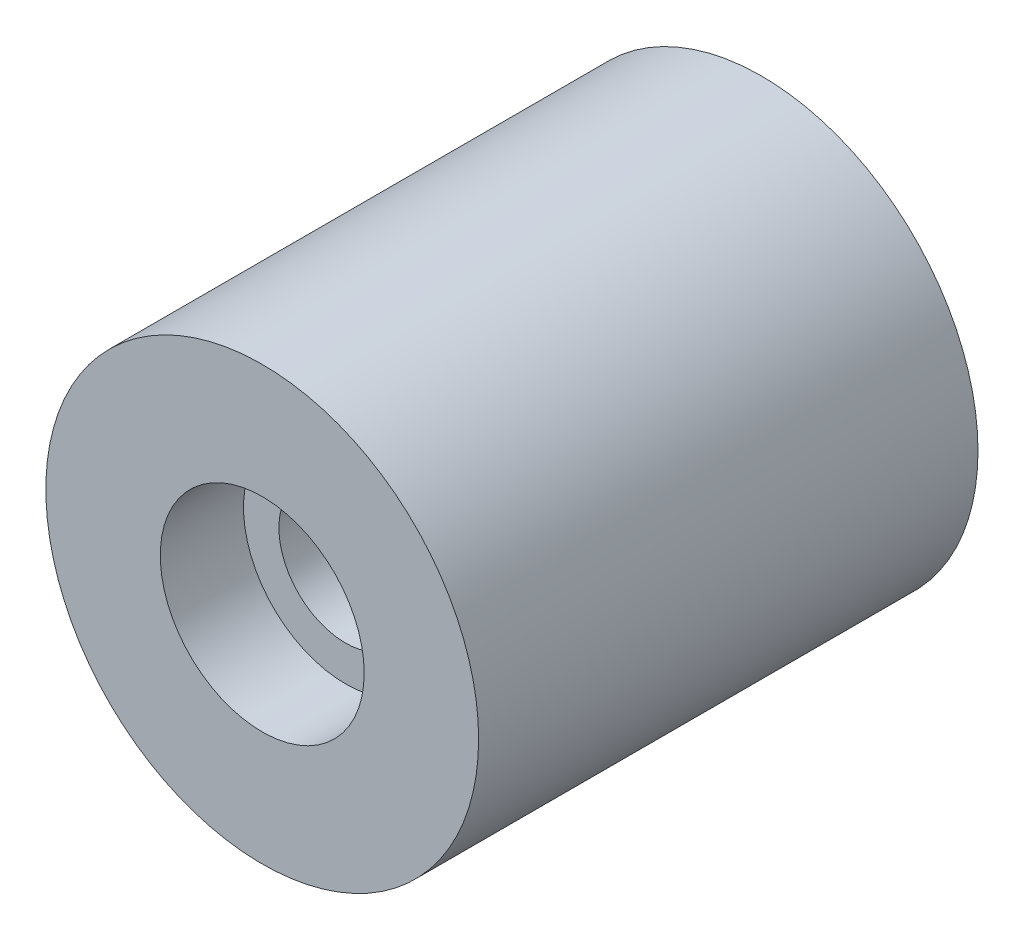
ISO-10303-21;
HEADER;
FILE_DESCRIPTION(('STEP AP214'),'2;1');
FILE_NAME('part.step','',(''),(''),'','','');
FILE_SCHEMA(('AUTOMOTIVE_DESIGN { 1 0 10303 214 1 1 1 1 }'));
ENDSEC;
DATA;
#1=APPLICATION_CONTEXT('core data for automotive mechanical design processes');
#2=APPLICATION_PROTOCOL_DEFINITION('international standard','automotive_design',2000,#1);
#3=PRODUCT_CONTEXT('',#1,'mechanical');
#4=PRODUCT('Part','Part','',(#3));
#5=PRODUCT_RELATED_PRODUCT_CATEGORY('part','',(#4));
#6=PRODUCT_DEFINITION_FORMATION('','',#4);
#7=PRODUCT_DEFINITION_CONTEXT('part definition',#1,'design');
#8=PRODUCT_DEFINITION('design','',#6,#7);
#9=PRODUCT_DEFINITION_SHAPE('','',#8);
#10=(LENGTH_UNIT() NAMED_UNIT(*) SI_UNIT(.MILLI.,.METRE.));
#11=(NAMED_UNIT(*) PLANE_ANGLE_UNIT() SI_UNIT($,.RADIAN.));
#12=(NAMED_UNIT(*) SI_UNIT($,.STERADIAN.) SOLID_ANGLE_UNIT());
#13=UNCERTAINTY_MEASURE_WITH_UNIT(LENGTH_MEASURE(1.E-05),#10,'distance_accuracy_value','');
#14=(GEOMETRIC_REPRESENTATION_CONTEXT(3) GLOBAL_UNCERTAINTY_ASSIGNED_CONTEXT((#13)) GLOBAL_UNIT_ASSIGNED_CONTEXT((#10,
#11,#12)) REPRESENTATION_CONTEXT('',''));
#15=CARTESIAN_POINT('',(0.,0.,0.));
#16=DIRECTION('',(0.,0.,1.));
#17=DIRECTION('',(1.,0.,0.));
#18=AXIS2_PLACEMENT_3D('',#15,#16,#17);
#19=CARTESIAN_POINT('',(15.,0.,6.));
#20=DIRECTION('',(0.,0.,1.));
#21=DIRECTION('',(1.,0.,0.));
#22=AXIS2_PLACEMENT_3D('',#19,#20,#21);
#23=CYLINDRICAL_SURFACE('',#22,2.);
#24=CARTESIAN_POINT('',(15.,0.,18.5));
#25=DIRECTION('',(0.,0.,1.));
#26=DIRECTION('',(1.,0.,0.));
#27=AXIS2_PLACEMENT_3D('',#24,#25,#26);
#28=CIRCLE('',#27,2.);
#29=CARTESIAN_POINT('',(17.,0.,18.5));
#30=VERTEX_POINT('',#29);
#31=EDGE_CURVE('E50',#30,#30,#28,.F.);
#32=ORIENTED_EDGE('',*,*,#31,.F.);
#33=EDGE_LOOP('',(#32));
#34=FACE_BOUND('',#33,.T.);
#35=CARTESIAN_POINT('',(15.,0.,8.5));
#36=DIRECTION('',(0.,0.,-1.));
#37=DIRECTION('',(-1.,0.,0.));
#38=AXIS2_PLACEMENT_3D('',#35,#36,#37);
#39=CIRCLE('',#38,2.);
#40=CARTESIAN_POINT('',(13.,0.,8.5));
#41=VERTEX_POINT('',#40);
#42=EDGE_CURVE('E41',#41,#41,#39,.F.);
#43=ORIENTED_EDGE('',*,*,#42,.F.);
#44=EDGE_LOOP('',(#43));
#45=FACE_BOUND('',#44,.T.);
#46=ADVANCED_FACE('F37',(#34,#45),#23,.F.);
#47=CARTESIAN_POINT('',(15.,0.,6.));
#48=DIRECTION('',(0.,0.,1.));
#49=DIRECTION('',(1.,0.,0.));
#50=AXIS2_PLACEMENT_3D('',#47,#48,#49);
#51=CYLINDRICAL_SURFACE('',#50,6.5);
#52=CARTESIAN_POINT('',(15.,0.,6.));
#53=DIRECTION('',(0.,0.,1.));
#54=DIRECTION('',(1.,0.,0.));
#55=AXIS2_PLACEMENT_3D('',#52,#53,#54);
#56=CIRCLE('',#55,6.5);
#57=CARTESIAN_POINT('',(21.5,0.,6.));
#58=VERTEX_POINT('',#57);
#59=EDGE_CURVE('E10',#58,#58,#56,.T.);
#60=ORIENTED_EDGE('',*,*,#59,.T.);
#61=EDGE_LOOP('',(#60));
#62=FACE_BOUND('',#61,.T.);
#63=CARTESIAN_POINT('',(15.,0.,21.));
#64=DIRECTION('',(0.,0.,1.));
#65=DIRECTION('',(1.,0.,0.));
#66=AXIS2_PLACEMENT_3D('',#63,#64,#65);
#67=CIRCLE('',#66,6.5);
#68=CARTESIAN_POINT('',(21.5,0.,21.));
#69=VERTEX_POINT('',#68);
#70=EDGE_CURVE('E45',#69,#69,#67,.T.);
#71=ORIENTED_EDGE('',*,*,#70,.F.);
#72=EDGE_LOOP('',(#71));
#73=FACE_BOUND('',#72,.T.);
#74=ADVANCED_FACE('F39',(#62,#73),#51,.T.);
#75=CARTESIAN_POINT('',(15.,0.,6.));
#76=DIRECTION('',(0.,0.,1.));
#77=DIRECTION('',(1.,0.,0.));
#78=AXIS2_PLACEMENT_3D('',#75,#76,#77);
#79=PLANE('',#78);
#80=CARTESIAN_POINT('',(15.,0.,6.));
#81=DIRECTION('',(0.,0.,1.));
#82=DIRECTION('',(1.,0.,0.));
#83=AXIS2_PLACEMENT_3D('',#80,#81,#82);
#84=CIRCLE('',#83,3.0625);
#85=CARTESIAN_POINT('',(18.0625,0.,6.));
#86=VERTEX_POINT('',#85);
#87=EDGE_CURVE('E64',#86,#86,#84,.T.);
#88=ORIENTED_EDGE('',*,*,#87,.T.);
#89=EDGE_LOOP('',(#88));
#90=FACE_BOUND('',#89,.T.);
#91=ORIENTED_EDGE('',*,*,#59,.F.);
#92=EDGE_LOOP('',(#91));
#93=FACE_BOUND('',#92,.T.);
#94=ADVANCED_FACE('F84',(#90,#93),#79,.F.);
#95=CARTESIAN_POINT('',(15.,0.,21.));
#96=DIRECTION('',(0.,0.,1.));
#97=DIRECTION('',(1.,0.,0.));
#98=AXIS2_PLACEMENT_3D('',#95,#96,#97);
#99=PLANE('',#98);
#100=CARTESIAN_POINT('',(15.,0.,21.));
#101=DIRECTION('',(0.,0.,1.));
#102=DIRECTION('',(1.,0.,0.));
#103=AXIS2_PLACEMENT_3D('',#100,#101,#102);
#104=CIRCLE('',#103,3.0625);
#105=CARTESIAN_POINT('',(18.0625,0.,21.));
#106=VERTEX_POINT('',#105);
#107=EDGE_CURVE('E58',#106,#106,#104,.T.);
#108=ORIENTED_EDGE('',*,*,#107,.F.);
#109=EDGE_LOOP('',(#108));
#110=FACE_BOUND('',#109,.T.);
#111=ORIENTED_EDGE('',*,*,#70,.T.);
#112=EDGE_LOOP('',(#111));
#113=FACE_BOUND('',#112,.T.);
#114=ADVANCED_FACE('F86',(#110,#113),#99,.T.);
#115=CARTESIAN_POINT('',(15.,0.,18.5));
#116=DIRECTION('',(0.,0.,1.));
#117=DIRECTION('',(1.,0.,0.));
#118=AXIS2_PLACEMENT_3D('',#115,#116,#117);
#119=PLANE('',#118);
#120=CARTESIAN_POINT('',(15.,0.,18.5));
#121=DIRECTION('',(0.,0.,1.));
#122=DIRECTION('',(1.,0.,0.));
#123=AXIS2_PLACEMENT_3D('',#120,#121,#122);
#124=CIRCLE('',#123,3.0625);
#125=CARTESIAN_POINT('',(18.0625,0.,18.5));
#126=VERTEX_POINT('',#125);
#127=EDGE_CURVE('E54',#126,#126,#124,.T.);
#128=ORIENTED_EDGE('',*,*,#127,.T.);
#129=EDGE_LOOP('',(#128));
#130=FACE_BOUND('',#129,.T.);
#131=ORIENTED_EDGE('',*,*,#31,.T.);
#132=EDGE_LOOP('',(#131));
#133=FACE_BOUND('',#132,.T.);
#134=ADVANCED_FACE('F93',(#130,#133),#119,.T.);
#135=CARTESIAN_POINT('',(15.,0.,18.5));
#136=DIRECTION('',(0.,0.,1.));
#137=DIRECTION('',(1.,0.,0.));
#138=AXIS2_PLACEMENT_3D('',#135,#136,#137);
#139=CYLINDRICAL_SURFACE('',#138,3.0625);
#140=ORIENTED_EDGE('',*,*,#127,.F.);
#141=EDGE_LOOP('',(#140));
#142=FACE_BOUND('',#141,.T.);
#143=ORIENTED_EDGE('',*,*,#107,.T.);
#144=EDGE_LOOP('',(#143));
#145=FACE_BOUND('',#144,.T.);
#146=ADVANCED_FACE('F103',(#142,#145),#139,.F.);
#147=CARTESIAN_POINT('',(15.,0.,8.5));
#148=DIRECTION('',(0.,0.,-1.));
#149=DIRECTION('',(1.,0.,0.));
#150=AXIS2_PLACEMENT_3D('',#147,#148,#149);
#151=PLANE('',#150);
#152=CARTESIAN_POINT('',(15.,0.,8.5));
#153=DIRECTION('',(0.,0.,1.));
#154=DIRECTION('',(1.,0.,0.));
#155=AXIS2_PLACEMENT_3D('',#152,#153,#154);
#156=CIRCLE('',#155,3.0625);
#157=CARTESIAN_POINT('',(18.0625,0.,8.5));
#158=VERTEX_POINT('',#157);
#159=EDGE_CURVE('E67',#158,#158,#156,.T.);
#160=ORIENTED_EDGE('',*,*,#159,.F.);
#161=EDGE_LOOP('',(#160));
#162=FACE_BOUND('',#161,.T.);
#163=ORIENTED_EDGE('',*,*,#42,.T.);
#164=EDGE_LOOP('',(#163));
#165=FACE_BOUND('',#164,.T.);
#166=ADVANCED_FACE('F74',(#162,#165),#151,.T.);
#167=CARTESIAN_POINT('',(15.,0.,8.5));
#168=DIRECTION('',(0.,0.,-1.));
#169=DIRECTION('',(-1.,0.,0.));
#170=AXIS2_PLACEMENT_3D('',#167,#168,#169);
#171=CYLINDRICAL_SURFACE('',#170,3.0625);
#172=ORIENTED_EDGE('',*,*,#159,.T.);
#173=EDGE_LOOP('',(#172));
#174=FACE_BOUND('',#173,.T.);
#175=ORIENTED_EDGE('',*,*,#87,.F.);
#176=EDGE_LOOP('',(#175));
#177=FACE_BOUND('',#176,.T.);
#178=ADVANCED_FACE('F98',(#174,#177),#171,.F.);
#179=CLOSED_SHELL('',(#46,#74,#94,#114,#134,#146,#166,#178));
#180=MANIFOLD_SOLID_BREP('B2',#179);
#181=ADVANCED_BREP_SHAPE_REPRESENTATION('',(#18,#180),#14);
#182=SHAPE_DEFINITION_REPRESENTATION(#9,#181);
ENDSEC;
END-ISO-10303-21;
